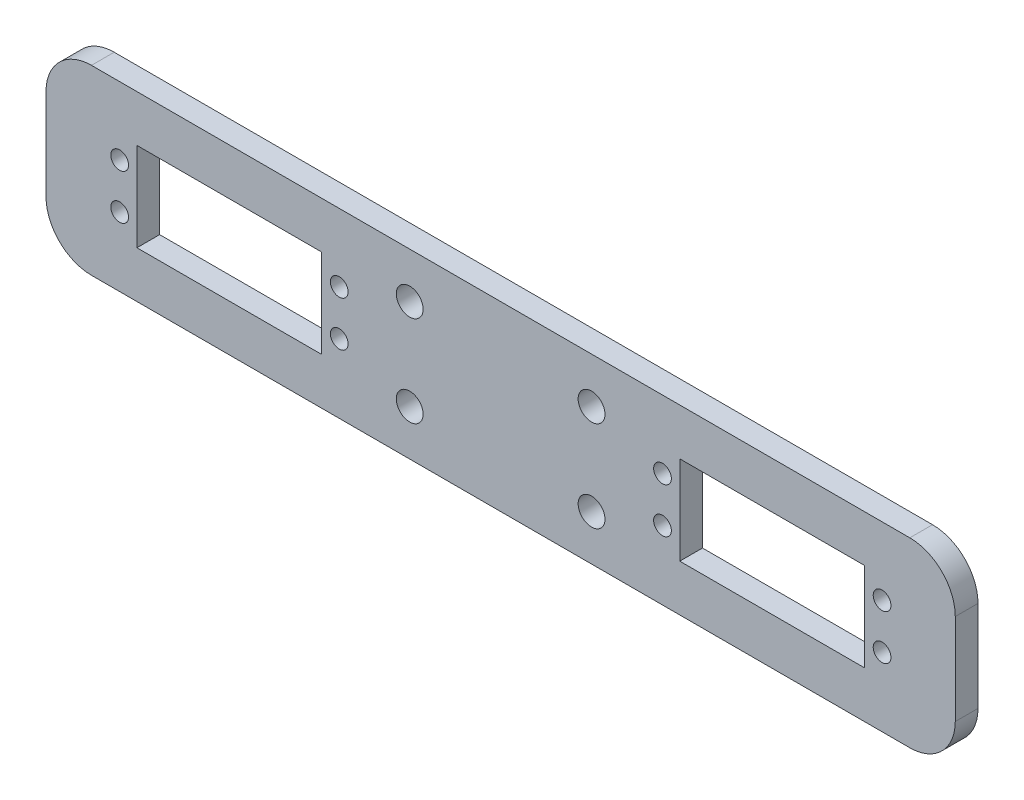
ISO-10303-21;
HEADER;
FILE_DESCRIPTION(('STEP AP214'),'2;1');
FILE_NAME('part.step','',(''),(''),'','','');
FILE_SCHEMA(('AUTOMOTIVE_DESIGN { 1 0 10303 214 1 1 1 1 }'));
ENDSEC;
DATA;
#1=APPLICATION_CONTEXT('core data for automotive mechanical design processes');
#2=APPLICATION_PROTOCOL_DEFINITION('international standard','automotive_design',2000,#1);
#3=PRODUCT_CONTEXT('',#1,'mechanical');
#4=PRODUCT('Part','Part','',(#3));
#5=PRODUCT_RELATED_PRODUCT_CATEGORY('part','',(#4));
#6=PRODUCT_DEFINITION_FORMATION('','',#4);
#7=PRODUCT_DEFINITION_CONTEXT('part definition',#1,'design');
#8=PRODUCT_DEFINITION('design','',#6,#7);
#9=PRODUCT_DEFINITION_SHAPE('','',#8);
#10=(LENGTH_UNIT() NAMED_UNIT(*) SI_UNIT(.MILLI.,.METRE.));
#11=(NAMED_UNIT(*) PLANE_ANGLE_UNIT() SI_UNIT($,.RADIAN.));
#12=(NAMED_UNIT(*) SI_UNIT($,.STERADIAN.) SOLID_ANGLE_UNIT());
#13=UNCERTAINTY_MEASURE_WITH_UNIT(LENGTH_MEASURE(1.E-05),#10,'distance_accuracy_value','');
#14=(GEOMETRIC_REPRESENTATION_CONTEXT(3) GLOBAL_UNCERTAINTY_ASSIGNED_CONTEXT((#13)) GLOBAL_UNIT_ASSIGNED_CONTEXT((#10,
#11,#12)) REPRESENTATION_CONTEXT('',''));
#15=CARTESIAN_POINT('',(0.,0.,0.));
#16=DIRECTION('',(0.,0.,1.));
#17=DIRECTION('',(1.,0.,0.));
#18=AXIS2_PLACEMENT_3D('',#15,#16,#17);
#19=CARTESIAN_POINT('',(74.9999999999999,15.,2.5));
#20=DIRECTION('',(0.,-1.,0.));
#21=DIRECTION('',(0.,0.,-1.));
#22=AXIS2_PLACEMENT_3D('',#19,#20,#21);
#23=PLANE('',#22);
#24=DIRECTION('',(-1.,0.,0.));
#25=VECTOR('',#24,1.);
#26=CARTESIAN_POINT('',(74.9999999999999,15.,2.5));
#27=LINE('',#26,#25);
#28=CARTESIAN_POINT('',(64.9999999999999,15.,2.5));
#29=VERTEX_POINT('',#28);
#30=CARTESIAN_POINT('',(-115.,15.,2.5));
#31=VERTEX_POINT('',#30);
#32=EDGE_CURVE('E195',#29,#31,#27,.T.);
#33=ORIENTED_EDGE('',*,*,#32,.F.);
#34=DIRECTION('',(0.,0.,-1.));
#35=VECTOR('',#34,1.);
#36=CARTESIAN_POINT('',(64.9999999999999,15.,2.5));
#37=LINE('',#36,#35);
#38=CARTESIAN_POINT('',(64.9999999999999,15.,-2.5));
#39=VERTEX_POINT('',#38);
#40=EDGE_CURVE('E251',#29,#39,#37,.T.);
#41=ORIENTED_EDGE('',*,*,#40,.T.);
#42=DIRECTION('',(-1.,0.,0.));
#43=VECTOR('',#42,1.);
#44=CARTESIAN_POINT('',(74.9999999999999,15.,-2.5));
#45=LINE('',#44,#43);
#46=CARTESIAN_POINT('',(-115.,15.,-2.5));
#47=VERTEX_POINT('',#46);
#48=EDGE_CURVE('E188',#39,#47,#45,.T.);
#49=ORIENTED_EDGE('',*,*,#48,.T.);
#50=DIRECTION('',(0.,0.,-1.));
#51=VECTOR('',#50,1.);
#52=CARTESIAN_POINT('',(-115.,15.,2.5));
#53=LINE('',#52,#51);
#54=EDGE_CURVE('E249',#47,#31,#53,.F.);
#55=ORIENTED_EDGE('',*,*,#54,.T.);
#56=EDGE_LOOP('',(#33,#41,#49,#55));
#57=FACE_BOUND('',#56,.T.);
#58=ADVANCED_FACE('F32',(#57),#23,.F.);
#59=CARTESIAN_POINT('',(-125.,-25.,2.5));
#60=DIRECTION('',(1.,0.,0.));
#61=DIRECTION('',(0.,1.,0.));
#62=AXIS2_PLACEMENT_3D('',#59,#60,#61);
#63=PLANE('',#62);
#64=DIRECTION('',(0.,-1.,0.));
#65=VECTOR('',#64,1.);
#66=CARTESIAN_POINT('',(-125.,-25.,-2.5));
#67=LINE('',#66,#65);
#68=CARTESIAN_POINT('',(-125.,4.99999999999997,-2.5));
#69=VERTEX_POINT('',#68);
#70=CARTESIAN_POINT('',(-125.,-15.,-2.5));
#71=VERTEX_POINT('',#70);
#72=EDGE_CURVE('E211',#69,#71,#67,.T.);
#73=ORIENTED_EDGE('',*,*,#72,.T.);
#74=DIRECTION('',(0.,0.,-1.));
#75=VECTOR('',#74,1.);
#76=CARTESIAN_POINT('',(-125.,-15.,2.5));
#77=LINE('',#76,#75);
#78=CARTESIAN_POINT('',(-125.,-15.,2.5));
#79=VERTEX_POINT('',#78);
#80=EDGE_CURVE('E234',#71,#79,#77,.F.);
#81=ORIENTED_EDGE('',*,*,#80,.T.);
#82=DIRECTION('',(0.,-1.,0.));
#83=VECTOR('',#82,1.);
#84=CARTESIAN_POINT('',(-125.,-25.,2.5));
#85=LINE('',#84,#83);
#86=CARTESIAN_POINT('',(-125.,4.99999999999997,2.5));
#87=VERTEX_POINT('',#86);
#88=EDGE_CURVE('E198',#87,#79,#85,.T.);
#89=ORIENTED_EDGE('',*,*,#88,.F.);
#90=DIRECTION('',(0.,0.,-1.));
#91=VECTOR('',#90,1.);
#92=CARTESIAN_POINT('',(-125.,4.99999999999997,2.5));
#93=LINE('',#92,#91);
#94=EDGE_CURVE('E231',#87,#69,#93,.T.);
#95=ORIENTED_EDGE('',*,*,#94,.T.);
#96=EDGE_LOOP('',(#73,#81,#89,#95));
#97=FACE_BOUND('',#96,.T.);
#98=ADVANCED_FACE('F361',(#97),#63,.F.);
#99=CARTESIAN_POINT('',(75.,-25.,2.5));
#100=DIRECTION('',(0.,1.,0.));
#101=DIRECTION('',(0.,0.,1.));
#102=AXIS2_PLACEMENT_3D('',#99,#100,#101);
#103=PLANE('',#102);
#104=DIRECTION('',(1.,0.,0.));
#105=VECTOR('',#104,1.);
#106=CARTESIAN_POINT('',(75.,-25.,2.5));
#107=LINE('',#106,#105);
#108=CARTESIAN_POINT('',(-115.,-25.,2.5));
#109=VERTEX_POINT('',#108);
#110=CARTESIAN_POINT('',(65.,-25.,2.5));
#111=VERTEX_POINT('',#110);
#112=EDGE_CURVE('E202',#109,#111,#107,.T.);
#113=ORIENTED_EDGE('',*,*,#112,.F.);
#114=DIRECTION('',(0.,0.,-1.));
#115=VECTOR('',#114,1.);
#116=CARTESIAN_POINT('',(-115.,-25.,2.5));
#117=LINE('',#116,#115);
#118=CARTESIAN_POINT('',(-115.,-25.,-2.5));
#119=VERTEX_POINT('',#118);
#120=EDGE_CURVE('E220',#109,#119,#117,.T.);
#121=ORIENTED_EDGE('',*,*,#120,.T.);
#122=DIRECTION('',(1.,0.,0.));
#123=VECTOR('',#122,1.);
#124=CARTESIAN_POINT('',(75.,-25.,-2.5));
#125=LINE('',#124,#123);
#126=CARTESIAN_POINT('',(65.,-25.,-2.5));
#127=VERTEX_POINT('',#126);
#128=EDGE_CURVE('E214',#119,#127,#125,.T.);
#129=ORIENTED_EDGE('',*,*,#128,.T.);
#130=DIRECTION('',(0.,0.,-1.));
#131=VECTOR('',#130,1.);
#132=CARTESIAN_POINT('',(65.,-25.,2.5));
#133=LINE('',#132,#131);
#134=EDGE_CURVE('E208',#127,#111,#133,.F.);
#135=ORIENTED_EDGE('',*,*,#134,.T.);
#136=EDGE_LOOP('',(#113,#121,#129,#135));
#137=FACE_BOUND('',#136,.T.);
#138=ADVANCED_FACE('F354',(#137),#103,.F.);
#139=CARTESIAN_POINT('',(75.,-25.,2.5));
#140=DIRECTION('',(-1.,0.,0.));
#141=DIRECTION('',(0.,-1.,0.));
#142=AXIS2_PLACEMENT_3D('',#139,#140,#141);
#143=PLANE('',#142);
#144=DIRECTION('',(0.,1.,0.));
#145=VECTOR('',#144,1.);
#146=CARTESIAN_POINT('',(75.,-25.,2.5));
#147=LINE('',#146,#145);
#148=CARTESIAN_POINT('',(75.,-15.,2.5));
#149=VERTEX_POINT('',#148);
#150=CARTESIAN_POINT('',(74.9999999999999,5.,2.5));
#151=VERTEX_POINT('',#150);
#152=EDGE_CURVE('E205',#149,#151,#147,.T.);
#153=ORIENTED_EDGE('',*,*,#152,.F.);
#154=DIRECTION('',(0.,0.,-1.));
#155=VECTOR('',#154,1.);
#156=CARTESIAN_POINT('',(75.,-15.,2.5));
#157=LINE('',#156,#155);
#158=CARTESIAN_POINT('',(75.,-15.,-2.5));
#159=VERTEX_POINT('',#158);
#160=EDGE_CURVE('E246',#149,#159,#157,.T.);
#161=ORIENTED_EDGE('',*,*,#160,.T.);
#162=DIRECTION('',(0.,1.,0.));
#163=VECTOR('',#162,1.);
#164=CARTESIAN_POINT('',(75.,-25.,-2.5));
#165=LINE('',#164,#163);
#166=CARTESIAN_POINT('',(74.9999999999999,5.,-2.5));
#167=VERTEX_POINT('',#166);
#168=EDGE_CURVE('E199',#159,#167,#165,.T.);
#169=ORIENTED_EDGE('',*,*,#168,.T.);
#170=DIRECTION('',(0.,0.,-1.));
#171=VECTOR('',#170,1.);
#172=CARTESIAN_POINT('',(74.9999999999999,5.,2.5));
#173=LINE('',#172,#171);
#174=EDGE_CURVE('E244',#167,#151,#173,.F.);
#175=ORIENTED_EDGE('',*,*,#174,.T.);
#176=EDGE_LOOP('',(#153,#161,#169,#175));
#177=FACE_BOUND('',#176,.T.);
#178=ADVANCED_FACE('F344',(#177),#143,.F.);
#179=CARTESIAN_POINT('',(-125.,15.,2.5));
#180=DIRECTION('',(0.,0.,-1.));
#181=DIRECTION('',(-1.,0.,0.));
#182=AXIS2_PLACEMENT_3D('',#179,#180,#181);
#183=PLANE('',#182);
#184=CARTESIAN_POINT('',(-5.00000000000005,5.00000000000001,2.5));
#185=DIRECTION('',(0.,0.,1.));
#186=DIRECTION('',(-1.,0.,0.));
#187=AXIS2_PLACEMENT_3D('',#184,#185,#186);
#188=CIRCLE('',#187,2.95);
#189=CARTESIAN_POINT('',(-7.95000000000005,5.00000000000001,2.5));
#190=VERTEX_POINT('',#189);
#191=EDGE_CURVE('E318',#190,#190,#188,.T.);
#192=ORIENTED_EDGE('',*,*,#191,.F.);
#193=EDGE_LOOP('',(#192));
#194=FACE_BOUND('',#193,.T.);
#195=CARTESIAN_POINT('',(-5.00000000000005,-15.,2.5));
#196=DIRECTION('',(0.,0.,1.));
#197=DIRECTION('',(1.,0.,0.));
#198=AXIS2_PLACEMENT_3D('',#195,#196,#197);
#199=CIRCLE('',#198,2.95);
#200=CARTESIAN_POINT('',(-2.05000000000005,-15.,2.5));
#201=VERTEX_POINT('',#200);
#202=EDGE_CURVE('E308',#201,#201,#199,.T.);
#203=ORIENTED_EDGE('',*,*,#202,.F.);
#204=EDGE_LOOP('',(#203));
#205=FACE_BOUND('',#204,.T.);
#206=CARTESIAN_POINT('',(-45.,-15.,2.5));
#207=DIRECTION('',(0.,0.,1.));
#208=DIRECTION('',(-1.,0.,0.));
#209=AXIS2_PLACEMENT_3D('',#206,#207,#208);
#210=CIRCLE('',#209,2.95);
#211=CARTESIAN_POINT('',(-47.95,-15.,2.5));
#212=VERTEX_POINT('',#211);
#213=EDGE_CURVE('E305',#212,#212,#210,.T.);
#214=ORIENTED_EDGE('',*,*,#213,.F.);
#215=EDGE_LOOP('',(#214));
#216=FACE_BOUND('',#215,.T.);
#217=CARTESIAN_POINT('',(-45.,5.00000000000001,2.5));
#218=DIRECTION('',(0.,0.,1.));
#219=DIRECTION('',(1.,0.,0.));
#220=AXIS2_PLACEMENT_3D('',#217,#218,#219);
#221=CIRCLE('',#220,2.95);
#222=CARTESIAN_POINT('',(-42.05,5.00000000000001,2.5));
#223=VERTEX_POINT('',#222);
#224=EDGE_CURVE('E302',#223,#223,#221,.T.);
#225=ORIENTED_EDGE('',*,*,#224,.F.);
#226=EDGE_LOOP('',(#225));
#227=FACE_BOUND('',#226,.T.);
#228=CARTESIAN_POINT('',(-60.5,-9.84999999999999,2.5));
#229=DIRECTION('',(0.,0.,1.));
#230=DIRECTION('',(1.,0.,0.));
#231=AXIS2_PLACEMENT_3D('',#228,#229,#230);
#232=CIRCLE('',#231,1.95);
#233=CARTESIAN_POINT('',(-58.55,-9.84999999999999,2.5));
#234=VERTEX_POINT('',#233);
#235=EDGE_CURVE('E298',#234,#234,#232,.T.);
#236=ORIENTED_EDGE('',*,*,#235,.F.);
#237=EDGE_LOOP('',(#236));
#238=FACE_BOUND('',#237,.T.);
#239=CARTESIAN_POINT('',(-60.5,0.0500000000000092,2.5));
#240=DIRECTION('',(0.,0.,1.));
#241=DIRECTION('',(1.,0.,0.));
#242=AXIS2_PLACEMENT_3D('',#239,#240,#241);
#243=CIRCLE('',#242,1.95);
#244=CARTESIAN_POINT('',(-58.55,0.0500000000000092,2.5));
#245=VERTEX_POINT('',#244);
#246=EDGE_CURVE('E294',#245,#245,#243,.T.);
#247=ORIENTED_EDGE('',*,*,#246,.F.);
#248=EDGE_LOOP('',(#247));
#249=FACE_BOUND('',#248,.T.);
#250=CARTESIAN_POINT('',(-108.8,0.0500000000000006,2.5));
#251=DIRECTION('',(0.,0.,1.));
#252=DIRECTION('',(1.,0.,0.));
#253=AXIS2_PLACEMENT_3D('',#250,#251,#252);
#254=CIRCLE('',#253,1.95);
#255=CARTESIAN_POINT('',(-106.85,0.0500000000000006,2.5));
#256=VERTEX_POINT('',#255);
#257=EDGE_CURVE('E290',#256,#256,#254,.T.);
#258=ORIENTED_EDGE('',*,*,#257,.F.);
#259=EDGE_LOOP('',(#258));
#260=FACE_BOUND('',#259,.T.);
#261=CARTESIAN_POINT('',(-108.8,-9.85,2.5));
#262=DIRECTION('',(0.,0.,1.));
#263=DIRECTION('',(1.,0.,0.));
#264=AXIS2_PLACEMENT_3D('',#261,#262,#263);
#265=CIRCLE('',#264,1.95);
#266=CARTESIAN_POINT('',(-106.85,-9.85,2.5));
#267=VERTEX_POINT('',#266);
#268=EDGE_CURVE('E286',#267,#267,#265,.T.);
#269=ORIENTED_EDGE('',*,*,#268,.F.);
#270=EDGE_LOOP('',(#269));
#271=FACE_BOUND('',#270,.T.);
#272=CARTESIAN_POINT('',(10.6,-9.85,2.5));
#273=DIRECTION('',(0.,0.,1.));
#274=DIRECTION('',(1.,0.,0.));
#275=AXIS2_PLACEMENT_3D('',#272,#273,#274);
#276=CIRCLE('',#275,1.95);
#277=CARTESIAN_POINT('',(12.55,-9.85,2.5));
#278=VERTEX_POINT('',#277);
#279=EDGE_CURVE('E282',#278,#278,#276,.T.);
#280=ORIENTED_EDGE('',*,*,#279,.F.);
#281=EDGE_LOOP('',(#280));
#282=FACE_BOUND('',#281,.T.);
#283=CARTESIAN_POINT('',(10.6,0.0500000000000014,2.5));
#284=DIRECTION('',(0.,0.,1.));
#285=DIRECTION('',(1.,0.,0.));
#286=AXIS2_PLACEMENT_3D('',#283,#284,#285);
#287=CIRCLE('',#286,1.95);
#288=CARTESIAN_POINT('',(12.55,0.0500000000000014,2.5));
#289=VERTEX_POINT('',#288);
#290=EDGE_CURVE('E278',#289,#289,#287,.T.);
#291=ORIENTED_EDGE('',*,*,#290,.F.);
#292=EDGE_LOOP('',(#291));
#293=FACE_BOUND('',#292,.T.);
#294=CARTESIAN_POINT('',(58.9,0.0500000000000101,2.5));
#295=DIRECTION('',(0.,0.,1.));
#296=DIRECTION('',(1.,0.,0.));
#297=AXIS2_PLACEMENT_3D('',#294,#295,#296);
#298=CIRCLE('',#297,1.95);
#299=CARTESIAN_POINT('',(60.85,0.0500000000000101,2.5));
#300=VERTEX_POINT('',#299);
#301=EDGE_CURVE('E274',#300,#300,#298,.T.);
#302=ORIENTED_EDGE('',*,*,#301,.F.);
#303=EDGE_LOOP('',(#302));
#304=FACE_BOUND('',#303,.T.);
#305=CARTESIAN_POINT('',(58.9,-9.84999999999999,2.5));
#306=DIRECTION('',(0.,0.,1.));
#307=DIRECTION('',(1.,0.,0.));
#308=AXIS2_PLACEMENT_3D('',#305,#306,#307);
#309=CIRCLE('',#308,1.95);
#310=CARTESIAN_POINT('',(60.85,-9.84999999999999,2.5));
#311=VERTEX_POINT('',#310);
#312=EDGE_CURVE('E270',#311,#311,#309,.T.);
#313=ORIENTED_EDGE('',*,*,#312,.F.);
#314=EDGE_LOOP('',(#313));
#315=FACE_BOUND('',#314,.T.);
#316=DIRECTION('',(-1.,0.,0.));
#317=VECTOR('',#316,1.);
#318=CARTESIAN_POINT('',(55.,4.74999999999999,2.5));
#319=LINE('',#318,#317);
#320=CARTESIAN_POINT('',(55.,4.74999999999999,2.5));
#321=VERTEX_POINT('',#320);
#322=CARTESIAN_POINT('',(14.4,4.74999999999999,2.5));
#323=VERTEX_POINT('',#322);
#324=EDGE_CURVE('E158',#321,#323,#319,.T.);
#325=ORIENTED_EDGE('',*,*,#324,.F.);
#326=DIRECTION('',(0.,1.,0.));
#327=VECTOR('',#326,1.);
#328=CARTESIAN_POINT('',(55.,-14.75,2.5));
#329=LINE('',#328,#327);
#330=CARTESIAN_POINT('',(55.,-14.75,2.5));
#331=VERTEX_POINT('',#330);
#332=EDGE_CURVE('E49',#331,#321,#329,.T.);
#333=ORIENTED_EDGE('',*,*,#332,.F.);
#334=DIRECTION('',(1.,0.,0.));
#335=VECTOR('',#334,1.);
#336=CARTESIAN_POINT('',(55.,-14.75,2.5));
#337=LINE('',#336,#335);
#338=CARTESIAN_POINT('',(14.4,-14.75,2.5));
#339=VERTEX_POINT('',#338);
#340=EDGE_CURVE('E165',#339,#331,#337,.T.);
#341=ORIENTED_EDGE('',*,*,#340,.F.);
#342=DIRECTION('',(0.,-1.,0.));
#343=VECTOR('',#342,1.);
#344=CARTESIAN_POINT('',(14.4,4.74999999999999,2.5));
#345=LINE('',#344,#343);
#346=EDGE_CURVE('E149',#323,#339,#345,.T.);
#347=ORIENTED_EDGE('',*,*,#346,.F.);
#348=EDGE_LOOP('',(#325,#333,#341,#347));
#349=FACE_BOUND('',#348,.T.);
#350=DIRECTION('',(0.,1.,0.));
#351=VECTOR('',#350,1.);
#352=CARTESIAN_POINT('',(-64.4,4.74999999999999,2.5));
#353=LINE('',#352,#351);
#354=CARTESIAN_POINT('',(-64.4,-14.75,2.5));
#355=VERTEX_POINT('',#354);
#356=CARTESIAN_POINT('',(-64.4,4.74999999999999,2.5));
#357=VERTEX_POINT('',#356);
#358=EDGE_CURVE('E176',#355,#357,#353,.T.);
#359=ORIENTED_EDGE('',*,*,#358,.F.);
#360=DIRECTION('',(1.,0.,0.));
#361=VECTOR('',#360,1.);
#362=CARTESIAN_POINT('',(-105.,-14.75,2.5));
#363=LINE('',#362,#361);
#364=CARTESIAN_POINT('',(-105.,-14.75,2.5));
#365=VERTEX_POINT('',#364);
#366=EDGE_CURVE('E172',#365,#355,#363,.T.);
#367=ORIENTED_EDGE('',*,*,#366,.F.);
#368=DIRECTION('',(0.,-1.,0.));
#369=VECTOR('',#368,1.);
#370=CARTESIAN_POINT('',(-105.,-14.75,2.5));
#371=LINE('',#370,#369);
#372=CARTESIAN_POINT('',(-105.,4.74999999999999,2.5));
#373=VERTEX_POINT('',#372);
#374=EDGE_CURVE('E182',#373,#365,#371,.T.);
#375=ORIENTED_EDGE('',*,*,#374,.F.);
#376=DIRECTION('',(-1.,0.,0.));
#377=VECTOR('',#376,1.);
#378=CARTESIAN_POINT('',(-105.,4.74999999999999,2.5));
#379=LINE('',#378,#377);
#380=EDGE_CURVE('E179',#357,#373,#379,.T.);
#381=ORIENTED_EDGE('',*,*,#380,.F.);
#382=EDGE_LOOP('',(#359,#367,#375,#381));
#383=FACE_BOUND('',#382,.T.);
#384=ORIENTED_EDGE('',*,*,#88,.T.);
#385=CARTESIAN_POINT('',(-115.,-15.,2.5));
#386=DIRECTION('',(0.,0.,-1.));
#387=DIRECTION('',(-1.,0.,0.));
#388=AXIS2_PLACEMENT_3D('',#385,#386,#387);
#389=CIRCLE('',#388,10.);
#390=EDGE_CURVE('E242',#79,#109,#389,.F.);
#391=ORIENTED_EDGE('',*,*,#390,.T.);
#392=ORIENTED_EDGE('',*,*,#112,.T.);
#393=CARTESIAN_POINT('',(65.,-15.,2.5));
#394=DIRECTION('',(0.,0.,-1.));
#395=DIRECTION('',(-1.,0.,0.));
#396=AXIS2_PLACEMENT_3D('',#393,#394,#395);
#397=CIRCLE('',#396,10.);
#398=EDGE_CURVE('E240',#111,#149,#397,.F.);
#399=ORIENTED_EDGE('',*,*,#398,.T.);
#400=ORIENTED_EDGE('',*,*,#152,.T.);
#401=CARTESIAN_POINT('',(64.9999999999999,5.,2.5));
#402=DIRECTION('',(0.,0.,-1.));
#403=DIRECTION('',(-1.,0.,0.));
#404=AXIS2_PLACEMENT_3D('',#401,#402,#403);
#405=CIRCLE('',#404,10.);
#406=EDGE_CURVE('E238',#151,#29,#405,.F.);
#407=ORIENTED_EDGE('',*,*,#406,.T.);
#408=ORIENTED_EDGE('',*,*,#32,.T.);
#409=CARTESIAN_POINT('',(-115.,5.,2.5));
#410=DIRECTION('',(0.,0.,-1.));
#411=DIRECTION('',(-1.,0.,0.));
#412=AXIS2_PLACEMENT_3D('',#409,#410,#411);
#413=CIRCLE('',#412,10.);
#414=EDGE_CURVE('E236',#31,#87,#413,.F.);
#415=ORIENTED_EDGE('',*,*,#414,.T.);
#416=EDGE_LOOP('',(#384,#391,#392,#399,#400,#407,#408,#415));
#417=FACE_BOUND('',#416,.T.);
#418=ADVANCED_FACE('F162',(#194,#205,#216,#227,#238,#249,#260,#271,#282,#293,#304,#315,#349,
#383,#417),#183,.F.);
#419=CARTESIAN_POINT('',(-125.,15.,-2.5));
#420=DIRECTION('',(0.,0.,-1.));
#421=DIRECTION('',(-1.,0.,0.));
#422=AXIS2_PLACEMENT_3D('',#419,#420,#421);
#423=PLANE('',#422);
#424=CARTESIAN_POINT('',(-5.00000000000005,5.00000000000001,-2.5));
#425=DIRECTION('',(0.,0.,-1.));
#426=DIRECTION('',(-1.,0.,0.));
#427=AXIS2_PLACEMENT_3D('',#424,#425,#426);
#428=CIRCLE('',#427,2.95);
#429=CARTESIAN_POINT('',(-7.95000000000005,5.00000000000001,-2.5));
#430=VERTEX_POINT('',#429);
#431=EDGE_CURVE('E36',#430,#430,#428,.T.);
#432=ORIENTED_EDGE('',*,*,#431,.F.);
#433=EDGE_LOOP('',(#432));
#434=FACE_BOUND('',#433,.T.);
#435=CARTESIAN_POINT('',(-5.00000000000005,-15.,-2.5));
#436=DIRECTION('',(0.,0.,-1.));
#437=DIRECTION('',(-1.,0.,0.));
#438=AXIS2_PLACEMENT_3D('',#435,#436,#437);
#439=CIRCLE('',#438,2.95);
#440=CARTESIAN_POINT('',(-7.95000000000006,-15.,-2.5));
#441=VERTEX_POINT('',#440);
#442=EDGE_CURVE('E306',#441,#441,#439,.T.);
#443=ORIENTED_EDGE('',*,*,#442,.F.);
#444=EDGE_LOOP('',(#443));
#445=FACE_BOUND('',#444,.T.);
#446=CARTESIAN_POINT('',(-45.,-15.,-2.5));
#447=DIRECTION('',(0.,0.,-1.));
#448=DIRECTION('',(-1.,0.,0.));
#449=AXIS2_PLACEMENT_3D('',#446,#447,#448);
#450=CIRCLE('',#449,2.95);
#451=CARTESIAN_POINT('',(-47.95,-15.,-2.5));
#452=VERTEX_POINT('',#451);
#453=EDGE_CURVE('E303',#452,#452,#450,.T.);
#454=ORIENTED_EDGE('',*,*,#453,.F.);
#455=EDGE_LOOP('',(#454));
#456=FACE_BOUND('',#455,.T.);
#457=CARTESIAN_POINT('',(-45.,5.00000000000001,-2.5));
#458=DIRECTION('',(0.,0.,-1.));
#459=DIRECTION('',(-1.,0.,0.));
#460=AXIS2_PLACEMENT_3D('',#457,#458,#459);
#461=CIRCLE('',#460,2.95);
#462=CARTESIAN_POINT('',(-47.95,5.00000000000001,-2.5));
#463=VERTEX_POINT('',#462);
#464=EDGE_CURVE('E299',#463,#463,#461,.T.);
#465=ORIENTED_EDGE('',*,*,#464,.F.);
#466=EDGE_LOOP('',(#465));
#467=FACE_BOUND('',#466,.T.);
#468=CARTESIAN_POINT('',(-60.5,-9.84999999999999,-2.5));
#469=DIRECTION('',(0.,0.,-1.));
#470=DIRECTION('',(-1.,0.,0.));
#471=AXIS2_PLACEMENT_3D('',#468,#469,#470);
#472=CIRCLE('',#471,1.95);
#473=CARTESIAN_POINT('',(-62.45,-9.84999999999999,-2.5));
#474=VERTEX_POINT('',#473);
#475=EDGE_CURVE('E295',#474,#474,#472,.T.);
#476=ORIENTED_EDGE('',*,*,#475,.F.);
#477=EDGE_LOOP('',(#476));
#478=FACE_BOUND('',#477,.T.);
#479=CARTESIAN_POINT('',(-60.5,0.0500000000000092,-2.5));
#480=DIRECTION('',(0.,0.,-1.));
#481=DIRECTION('',(-1.,0.,0.));
#482=AXIS2_PLACEMENT_3D('',#479,#480,#481);
#483=CIRCLE('',#482,1.95);
#484=CARTESIAN_POINT('',(-62.45,0.0500000000000092,-2.5));
#485=VERTEX_POINT('',#484);
#486=EDGE_CURVE('E291',#485,#485,#483,.T.);
#487=ORIENTED_EDGE('',*,*,#486,.F.);
#488=EDGE_LOOP('',(#487));
#489=FACE_BOUND('',#488,.T.);
#490=CARTESIAN_POINT('',(-108.8,0.0500000000000006,-2.5));
#491=DIRECTION('',(0.,0.,-1.));
#492=DIRECTION('',(-1.,0.,0.));
#493=AXIS2_PLACEMENT_3D('',#490,#491,#492);
#494=CIRCLE('',#493,1.95);
#495=CARTESIAN_POINT('',(-110.75,0.0500000000000006,-2.5));
#496=VERTEX_POINT('',#495);
#497=EDGE_CURVE('E287',#496,#496,#494,.T.);
#498=ORIENTED_EDGE('',*,*,#497,.F.);
#499=EDGE_LOOP('',(#498));
#500=FACE_BOUND('',#499,.T.);
#501=CARTESIAN_POINT('',(-108.8,-9.85,-2.5));
#502=DIRECTION('',(0.,0.,-1.));
#503=DIRECTION('',(-1.,0.,0.));
#504=AXIS2_PLACEMENT_3D('',#501,#502,#503);
#505=CIRCLE('',#504,1.95);
#506=CARTESIAN_POINT('',(-110.75,-9.85,-2.5));
#507=VERTEX_POINT('',#506);
#508=EDGE_CURVE('E283',#507,#507,#505,.T.);
#509=ORIENTED_EDGE('',*,*,#508,.F.);
#510=EDGE_LOOP('',(#509));
#511=FACE_BOUND('',#510,.T.);
#512=CARTESIAN_POINT('',(10.6,-9.85,-2.5));
#513=DIRECTION('',(0.,0.,-1.));
#514=DIRECTION('',(-1.,0.,0.));
#515=AXIS2_PLACEMENT_3D('',#512,#513,#514);
#516=CIRCLE('',#515,1.95);
#517=CARTESIAN_POINT('',(8.64999999999996,-9.85,-2.5));
#518=VERTEX_POINT('',#517);
#519=EDGE_CURVE('E279',#518,#518,#516,.T.);
#520=ORIENTED_EDGE('',*,*,#519,.F.);
#521=EDGE_LOOP('',(#520));
#522=FACE_BOUND('',#521,.T.);
#523=CARTESIAN_POINT('',(10.6,0.0500000000000014,-2.5));
#524=DIRECTION('',(0.,0.,-1.));
#525=DIRECTION('',(-1.,0.,0.));
#526=AXIS2_PLACEMENT_3D('',#523,#524,#525);
#527=CIRCLE('',#526,1.95);
#528=CARTESIAN_POINT('',(8.64999999999996,0.0500000000000014,-2.5));
#529=VERTEX_POINT('',#528);
#530=EDGE_CURVE('E275',#529,#529,#527,.T.);
#531=ORIENTED_EDGE('',*,*,#530,.F.);
#532=EDGE_LOOP('',(#531));
#533=FACE_BOUND('',#532,.T.);
#534=CARTESIAN_POINT('',(58.9,0.0500000000000101,-2.5));
#535=DIRECTION('',(0.,0.,-1.));
#536=DIRECTION('',(-1.,0.,0.));
#537=AXIS2_PLACEMENT_3D('',#534,#535,#536);
#538=CIRCLE('',#537,1.95);
#539=CARTESIAN_POINT('',(56.95,0.0500000000000101,-2.5));
#540=VERTEX_POINT('',#539);
#541=EDGE_CURVE('E271',#540,#540,#538,.T.);
#542=ORIENTED_EDGE('',*,*,#541,.F.);
#543=EDGE_LOOP('',(#542));
#544=FACE_BOUND('',#543,.T.);
#545=CARTESIAN_POINT('',(58.9,-9.84999999999999,-2.5));
#546=DIRECTION('',(0.,0.,-1.));
#547=DIRECTION('',(-1.,0.,0.));
#548=AXIS2_PLACEMENT_3D('',#545,#546,#547);
#549=CIRCLE('',#548,1.95);
#550=CARTESIAN_POINT('',(56.95,-9.84999999999999,-2.5));
#551=VERTEX_POINT('',#550);
#552=EDGE_CURVE('E267',#551,#551,#549,.T.);
#553=ORIENTED_EDGE('',*,*,#552,.F.);
#554=EDGE_LOOP('',(#553));
#555=FACE_BOUND('',#554,.T.);
#556=DIRECTION('',(0.,-1.,0.));
#557=VECTOR('',#556,1.);
#558=CARTESIAN_POINT('',(55.,15.,-2.5));
#559=LINE('',#558,#557);
#560=CARTESIAN_POINT('',(55.,4.74999999999999,-2.5));
#561=VERTEX_POINT('',#560);
#562=CARTESIAN_POINT('',(55.,-14.75,-2.5));
#563=VERTEX_POINT('',#562);
#564=EDGE_CURVE('E11',#561,#563,#559,.T.);
#565=ORIENTED_EDGE('',*,*,#564,.F.);
#566=DIRECTION('',(1.,0.,0.));
#567=VECTOR('',#566,1.);
#568=CARTESIAN_POINT('',(-125.,4.74999999999999,-2.5));
#569=LINE('',#568,#567);
#570=CARTESIAN_POINT('',(14.4,4.74999999999999,-2.5));
#571=VERTEX_POINT('',#570);
#572=EDGE_CURVE('E263',#571,#561,#569,.T.);
#573=ORIENTED_EDGE('',*,*,#572,.F.);
#574=DIRECTION('',(0.,1.,0.));
#575=VECTOR('',#574,1.);
#576=CARTESIAN_POINT('',(14.4,15.,-2.5));
#577=LINE('',#576,#575);
#578=CARTESIAN_POINT('',(14.4,-14.75,-2.5));
#579=VERTEX_POINT('',#578);
#580=EDGE_CURVE('E152',#579,#571,#577,.T.);
#581=ORIENTED_EDGE('',*,*,#580,.F.);
#582=DIRECTION('',(-1.,0.,0.));
#583=VECTOR('',#582,1.);
#584=CARTESIAN_POINT('',(-125.,-14.75,-2.5));
#585=LINE('',#584,#583);
#586=EDGE_CURVE('E41',#563,#579,#585,.T.);
#587=ORIENTED_EDGE('',*,*,#586,.F.);
#588=EDGE_LOOP('',(#565,#573,#581,#587));
#589=FACE_BOUND('',#588,.T.);
#590=DIRECTION('',(-1.,0.,0.));
#591=VECTOR('',#590,1.);
#592=CARTESIAN_POINT('',(-125.,-14.75,-2.5));
#593=LINE('',#592,#591);
#594=CARTESIAN_POINT('',(-64.4,-14.75,-2.5));
#595=VERTEX_POINT('',#594);
#596=CARTESIAN_POINT('',(-105.,-14.75,-2.5));
#597=VERTEX_POINT('',#596);
#598=EDGE_CURVE('E261',#595,#597,#593,.T.);
#599=ORIENTED_EDGE('',*,*,#598,.F.);
#600=DIRECTION('',(0.,-1.,0.));
#601=VECTOR('',#600,1.);
#602=CARTESIAN_POINT('',(-64.4,15.,-2.5));
#603=LINE('',#602,#601);
#604=CARTESIAN_POINT('',(-64.4,4.74999999999999,-2.5));
#605=VERTEX_POINT('',#604);
#606=EDGE_CURVE('E254',#605,#595,#603,.T.);
#607=ORIENTED_EDGE('',*,*,#606,.F.);
#608=DIRECTION('',(1.,0.,0.));
#609=VECTOR('',#608,1.);
#610=CARTESIAN_POINT('',(-125.,4.74999999999999,-2.5));
#611=LINE('',#610,#609);
#612=CARTESIAN_POINT('',(-105.,4.74999999999999,-2.5));
#613=VERTEX_POINT('',#612);
#614=EDGE_CURVE('E256',#613,#605,#611,.T.);
#615=ORIENTED_EDGE('',*,*,#614,.F.);
#616=DIRECTION('',(0.,1.,0.));
#617=VECTOR('',#616,1.);
#618=CARTESIAN_POINT('',(-105.,15.,-2.5));
#619=LINE('',#618,#617);
#620=EDGE_CURVE('E259',#597,#613,#619,.T.);
#621=ORIENTED_EDGE('',*,*,#620,.F.);
#622=EDGE_LOOP('',(#599,#607,#615,#621));
#623=FACE_BOUND('',#622,.T.);
#624=ORIENTED_EDGE('',*,*,#128,.F.);
#625=CARTESIAN_POINT('',(-115.,-15.,-2.5));
#626=DIRECTION('',(0.,0.,-1.));
#627=DIRECTION('',(-1.,0.,0.));
#628=AXIS2_PLACEMENT_3D('',#625,#626,#627);
#629=CIRCLE('',#628,10.);
#630=EDGE_CURVE('E229',#119,#71,#629,.T.);
#631=ORIENTED_EDGE('',*,*,#630,.T.);
#632=ORIENTED_EDGE('',*,*,#72,.F.);
#633=CARTESIAN_POINT('',(-115.,5.,-2.5));
#634=DIRECTION('',(0.,0.,-1.));
#635=DIRECTION('',(-1.,0.,0.));
#636=AXIS2_PLACEMENT_3D('',#633,#634,#635);
#637=CIRCLE('',#636,10.);
#638=EDGE_CURVE('E223',#69,#47,#637,.T.);
#639=ORIENTED_EDGE('',*,*,#638,.T.);
#640=ORIENTED_EDGE('',*,*,#48,.F.);
#641=CARTESIAN_POINT('',(64.9999999999999,5.,-2.5));
#642=DIRECTION('',(0.,0.,-1.));
#643=DIRECTION('',(-1.,0.,0.));
#644=AXIS2_PLACEMENT_3D('',#641,#642,#643);
#645=CIRCLE('',#644,10.);
#646=EDGE_CURVE('E225',#39,#167,#645,.T.);
#647=ORIENTED_EDGE('',*,*,#646,.T.);
#648=ORIENTED_EDGE('',*,*,#168,.F.);
#649=CARTESIAN_POINT('',(65.,-15.,-2.5));
#650=DIRECTION('',(0.,0.,-1.));
#651=DIRECTION('',(-1.,0.,0.));
#652=AXIS2_PLACEMENT_3D('',#649,#650,#651);
#653=CIRCLE('',#652,10.);
#654=EDGE_CURVE('E227',#159,#127,#653,.T.);
#655=ORIENTED_EDGE('',*,*,#654,.T.);
#656=EDGE_LOOP('',(#624,#631,#632,#639,#640,#647,#648,#655));
#657=FACE_BOUND('',#656,.T.);
#658=ADVANCED_FACE('F343',(#434,#445,#456,#467,#478,#489,#500,#511,#522,#533,#544,#555,#589,
#623,#657),#423,.T.);
#659=CARTESIAN_POINT('',(-115.,-15.,2.5));
#660=DIRECTION('',(0.,0.,-1.));
#661=DIRECTION('',(-1.,0.,0.));
#662=AXIS2_PLACEMENT_3D('',#659,#660,#661);
#663=CYLINDRICAL_SURFACE('',#662,10.);
#664=ORIENTED_EDGE('',*,*,#390,.F.);
#665=ORIENTED_EDGE('',*,*,#80,.F.);
#666=ORIENTED_EDGE('',*,*,#630,.F.);
#667=ORIENTED_EDGE('',*,*,#120,.F.);
#668=EDGE_LOOP('',(#664,#665,#666,#667));
#669=FACE_BOUND('',#668,.T.);
#670=ADVANCED_FACE('F351',(#669),#663,.T.);
#671=CARTESIAN_POINT('',(65.,-15.,2.5));
#672=DIRECTION('',(0.,0.,-1.));
#673=DIRECTION('',(-1.,0.,0.));
#674=AXIS2_PLACEMENT_3D('',#671,#672,#673);
#675=CYLINDRICAL_SURFACE('',#674,10.);
#676=ORIENTED_EDGE('',*,*,#398,.F.);
#677=ORIENTED_EDGE('',*,*,#134,.F.);
#678=ORIENTED_EDGE('',*,*,#654,.F.);
#679=ORIENTED_EDGE('',*,*,#160,.F.);
#680=EDGE_LOOP('',(#676,#677,#678,#679));
#681=FACE_BOUND('',#680,.T.);
#682=ADVANCED_FACE('F374',(#681),#675,.T.);
#683=CARTESIAN_POINT('',(64.9999999999999,5.,2.5));
#684=DIRECTION('',(0.,0.,-1.));
#685=DIRECTION('',(-1.,0.,0.));
#686=AXIS2_PLACEMENT_3D('',#683,#684,#685);
#687=CYLINDRICAL_SURFACE('',#686,10.);
#688=ORIENTED_EDGE('',*,*,#406,.F.);
#689=ORIENTED_EDGE('',*,*,#174,.F.);
#690=ORIENTED_EDGE('',*,*,#646,.F.);
#691=ORIENTED_EDGE('',*,*,#40,.F.);
#692=EDGE_LOOP('',(#688,#689,#690,#691));
#693=FACE_BOUND('',#692,.T.);
#694=ADVANCED_FACE('F377',(#693),#687,.T.);
#695=CARTESIAN_POINT('',(-115.,5.,2.5));
#696=DIRECTION('',(0.,0.,-1.));
#697=DIRECTION('',(-1.,0.,0.));
#698=AXIS2_PLACEMENT_3D('',#695,#696,#697);
#699=CYLINDRICAL_SURFACE('',#698,10.);
#700=ORIENTED_EDGE('',*,*,#414,.F.);
#701=ORIENTED_EDGE('',*,*,#54,.F.);
#702=ORIENTED_EDGE('',*,*,#638,.F.);
#703=ORIENTED_EDGE('',*,*,#94,.F.);
#704=EDGE_LOOP('',(#700,#701,#702,#703));
#705=FACE_BOUND('',#704,.T.);
#706=ADVANCED_FACE('F34',(#705),#699,.T.);
#707=CARTESIAN_POINT('',(-105.,-14.75,-7.5));
#708=DIRECTION('',(0.,-1.,0.));
#709=DIRECTION('',(0.,0.,-1.));
#710=AXIS2_PLACEMENT_3D('',#707,#708,#709);
#711=PLANE('',#710);
#712=ORIENTED_EDGE('',*,*,#598,.T.);
#713=DIRECTION('',(0.,0.,1.));
#714=VECTOR('',#713,1.);
#715=CARTESIAN_POINT('',(-105.,-14.75,-7.5));
#716=LINE('',#715,#714);
#717=EDGE_CURVE('E186',#597,#365,#716,.T.);
#718=ORIENTED_EDGE('',*,*,#717,.T.);
#719=ORIENTED_EDGE('',*,*,#366,.T.);
#720=DIRECTION('',(0.,0.,1.));
#721=VECTOR('',#720,1.);
#722=CARTESIAN_POINT('',(-64.4,-14.75,-7.5));
#723=LINE('',#722,#721);
#724=EDGE_CURVE('E185',#595,#355,#723,.T.);
#725=ORIENTED_EDGE('',*,*,#724,.F.);
#726=EDGE_LOOP('',(#712,#718,#719,#725));
#727=FACE_BOUND('',#726,.T.);
#728=ADVANCED_FACE('F384',(#727),#711,.F.);
#729=CARTESIAN_POINT('',(-105.,-14.75,-7.5));
#730=DIRECTION('',(-1.,0.,0.));
#731=DIRECTION('',(0.,0.,1.));
#732=AXIS2_PLACEMENT_3D('',#729,#730,#731);
#733=PLANE('',#732);
#734=ORIENTED_EDGE('',*,*,#620,.T.);
#735=DIRECTION('',(0.,0.,1.));
#736=VECTOR('',#735,1.);
#737=CARTESIAN_POINT('',(-105.,4.74999999999999,-7.5));
#738=LINE('',#737,#736);
#739=EDGE_CURVE('E189',#613,#373,#738,.T.);
#740=ORIENTED_EDGE('',*,*,#739,.T.);
#741=ORIENTED_EDGE('',*,*,#374,.T.);
#742=ORIENTED_EDGE('',*,*,#717,.F.);
#743=EDGE_LOOP('',(#734,#740,#741,#742));
#744=FACE_BOUND('',#743,.T.);
#745=ADVANCED_FACE('F450',(#744),#733,.F.);
#746=CARTESIAN_POINT('',(-105.,4.74999999999999,-7.5));
#747=DIRECTION('',(0.,1.,0.));
#748=DIRECTION('',(0.,0.,1.));
#749=AXIS2_PLACEMENT_3D('',#746,#747,#748);
#750=PLANE('',#749);
#751=ORIENTED_EDGE('',*,*,#614,.T.);
#752=DIRECTION('',(0.,0.,1.));
#753=VECTOR('',#752,1.);
#754=CARTESIAN_POINT('',(-64.4,4.74999999999999,-7.5));
#755=LINE('',#754,#753);
#756=EDGE_CURVE('E191',#605,#357,#755,.T.);
#757=ORIENTED_EDGE('',*,*,#756,.T.);
#758=ORIENTED_EDGE('',*,*,#380,.T.);
#759=ORIENTED_EDGE('',*,*,#739,.F.);
#760=EDGE_LOOP('',(#751,#757,#758,#759));
#761=FACE_BOUND('',#760,.T.);
#762=ADVANCED_FACE('F459',(#761),#750,.F.);
#763=CARTESIAN_POINT('',(-64.4,4.74999999999999,-7.5));
#764=DIRECTION('',(1.,0.,0.));
#765=DIRECTION('',(0.,0.,-1.));
#766=AXIS2_PLACEMENT_3D('',#763,#764,#765);
#767=PLANE('',#766);
#768=ORIENTED_EDGE('',*,*,#606,.T.);
#769=ORIENTED_EDGE('',*,*,#724,.T.);
#770=ORIENTED_EDGE('',*,*,#358,.T.);
#771=ORIENTED_EDGE('',*,*,#756,.F.);
#772=EDGE_LOOP('',(#768,#769,#770,#771));
#773=FACE_BOUND('',#772,.T.);
#774=ADVANCED_FACE('F469',(#773),#767,.F.);
#775=CARTESIAN_POINT('',(55.,-14.75,-7.5));
#776=DIRECTION('',(1.,0.,0.));
#777=DIRECTION('',(0.,0.,-1.));
#778=AXIS2_PLACEMENT_3D('',#775,#776,#777);
#779=PLANE('',#778);
#780=ORIENTED_EDGE('',*,*,#564,.T.);
#781=DIRECTION('',(0.,0.,1.));
#782=VECTOR('',#781,1.);
#783=CARTESIAN_POINT('',(55.,-14.75,-7.5));
#784=LINE('',#783,#782);
#785=EDGE_CURVE('E170',#563,#331,#784,.T.);
#786=ORIENTED_EDGE('',*,*,#785,.T.);
#787=ORIENTED_EDGE('',*,*,#332,.T.);
#788=DIRECTION('',(0.,0.,1.));
#789=VECTOR('',#788,1.);
#790=CARTESIAN_POINT('',(55.,4.74999999999999,-7.5));
#791=LINE('',#790,#789);
#792=EDGE_CURVE('E155',#561,#321,#791,.T.);
#793=ORIENTED_EDGE('',*,*,#792,.F.);
#794=EDGE_LOOP('',(#780,#786,#787,#793));
#795=FACE_BOUND('',#794,.T.);
#796=ADVANCED_FACE('F479',(#795),#779,.F.);
#797=CARTESIAN_POINT('',(55.,-14.75,-7.5));
#798=DIRECTION('',(0.,-1.,0.));
#799=DIRECTION('',(0.,0.,-1.));
#800=AXIS2_PLACEMENT_3D('',#797,#798,#799);
#801=PLANE('',#800);
#802=ORIENTED_EDGE('',*,*,#586,.T.);
#803=DIRECTION('',(0.,0.,1.));
#804=VECTOR('',#803,1.);
#805=CARTESIAN_POINT('',(14.4,-14.75,-7.5));
#806=LINE('',#805,#804);
#807=EDGE_CURVE('E154',#579,#339,#806,.T.);
#808=ORIENTED_EDGE('',*,*,#807,.T.);
#809=ORIENTED_EDGE('',*,*,#340,.T.);
#810=ORIENTED_EDGE('',*,*,#785,.F.);
#811=EDGE_LOOP('',(#802,#808,#809,#810));
#812=FACE_BOUND('',#811,.T.);
#813=ADVANCED_FACE('F489',(#812),#801,.F.);
#814=CARTESIAN_POINT('',(14.4,4.74999999999999,-7.5));
#815=DIRECTION('',(-1.,0.,0.));
#816=DIRECTION('',(0.,0.,1.));
#817=AXIS2_PLACEMENT_3D('',#814,#815,#816);
#818=PLANE('',#817);
#819=ORIENTED_EDGE('',*,*,#580,.T.);
#820=DIRECTION('',(0.,0.,1.));
#821=VECTOR('',#820,1.);
#822=CARTESIAN_POINT('',(14.4,4.74999999999999,-7.5));
#823=LINE('',#822,#821);
#824=EDGE_CURVE('E57',#571,#323,#823,.T.);
#825=ORIENTED_EDGE('',*,*,#824,.T.);
#826=ORIENTED_EDGE('',*,*,#346,.T.);
#827=ORIENTED_EDGE('',*,*,#807,.F.);
#828=EDGE_LOOP('',(#819,#825,#826,#827));
#829=FACE_BOUND('',#828,.T.);
#830=ADVANCED_FACE('F146',(#829),#818,.F.);
#831=CARTESIAN_POINT('',(55.,4.74999999999999,-7.5));
#832=DIRECTION('',(0.,1.,0.));
#833=DIRECTION('',(0.,0.,1.));
#834=AXIS2_PLACEMENT_3D('',#831,#832,#833);
#835=PLANE('',#834);
#836=ORIENTED_EDGE('',*,*,#572,.T.);
#837=ORIENTED_EDGE('',*,*,#792,.T.);
#838=ORIENTED_EDGE('',*,*,#324,.T.);
#839=ORIENTED_EDGE('',*,*,#824,.F.);
#840=EDGE_LOOP('',(#836,#837,#838,#839));
#841=FACE_BOUND('',#840,.T.);
#842=ADVANCED_FACE('F159',(#841),#835,.F.);
#843=CARTESIAN_POINT('',(58.9,-9.84999999999999,-7.5));
#844=DIRECTION('',(0.,0.,1.));
#845=DIRECTION('',(1.,0.,0.));
#846=AXIS2_PLACEMENT_3D('',#843,#844,#845);
#847=CYLINDRICAL_SURFACE('',#846,1.95);
#848=ORIENTED_EDGE('',*,*,#552,.T.);
#849=EDGE_LOOP('',(#848));
#850=FACE_BOUND('',#849,.T.);
#851=ORIENTED_EDGE('',*,*,#312,.T.);
#852=EDGE_LOOP('',(#851));
#853=FACE_BOUND('',#852,.T.);
#854=ADVANCED_FACE('F340',(#850,#853),#847,.F.);
#855=CARTESIAN_POINT('',(58.9,0.0500000000000101,-7.5));
#856=DIRECTION('',(0.,0.,1.));
#857=DIRECTION('',(1.,0.,0.));
#858=AXIS2_PLACEMENT_3D('',#855,#856,#857);
#859=CYLINDRICAL_SURFACE('',#858,1.95);
#860=ORIENTED_EDGE('',*,*,#541,.T.);
#861=EDGE_LOOP('',(#860));
#862=FACE_BOUND('',#861,.T.);
#863=ORIENTED_EDGE('',*,*,#301,.T.);
#864=EDGE_LOOP('',(#863));
#865=FACE_BOUND('',#864,.T.);
#866=ADVANCED_FACE('F523',(#862,#865),#859,.F.);
#867=CARTESIAN_POINT('',(10.6,0.0500000000000014,-7.5));
#868=DIRECTION('',(0.,0.,1.));
#869=DIRECTION('',(1.,0.,0.));
#870=AXIS2_PLACEMENT_3D('',#867,#868,#869);
#871=CYLINDRICAL_SURFACE('',#870,1.95);
#872=ORIENTED_EDGE('',*,*,#530,.T.);
#873=EDGE_LOOP('',(#872));
#874=FACE_BOUND('',#873,.T.);
#875=ORIENTED_EDGE('',*,*,#290,.T.);
#876=EDGE_LOOP('',(#875));
#877=FACE_BOUND('',#876,.T.);
#878=ADVANCED_FACE('F533',(#874,#877),#871,.F.);
#879=CARTESIAN_POINT('',(10.6,-9.85,-7.5));
#880=DIRECTION('',(0.,0.,1.));
#881=DIRECTION('',(1.,0.,0.));
#882=AXIS2_PLACEMENT_3D('',#879,#880,#881);
#883=CYLINDRICAL_SURFACE('',#882,1.95);
#884=ORIENTED_EDGE('',*,*,#519,.T.);
#885=EDGE_LOOP('',(#884));
#886=FACE_BOUND('',#885,.T.);
#887=ORIENTED_EDGE('',*,*,#279,.T.);
#888=EDGE_LOOP('',(#887));
#889=FACE_BOUND('',#888,.T.);
#890=ADVANCED_FACE('F543',(#886,#889),#883,.F.);
#891=CARTESIAN_POINT('',(-108.8,-9.85,-7.5));
#892=DIRECTION('',(0.,0.,1.));
#893=DIRECTION('',(1.,0.,0.));
#894=AXIS2_PLACEMENT_3D('',#891,#892,#893);
#895=CYLINDRICAL_SURFACE('',#894,1.95);
#896=ORIENTED_EDGE('',*,*,#508,.T.);
#897=EDGE_LOOP('',(#896));
#898=FACE_BOUND('',#897,.T.);
#899=ORIENTED_EDGE('',*,*,#268,.T.);
#900=EDGE_LOOP('',(#899));
#901=FACE_BOUND('',#900,.T.);
#902=ADVANCED_FACE('F553',(#898,#901),#895,.F.);
#903=CARTESIAN_POINT('',(-108.8,0.0500000000000006,-7.5));
#904=DIRECTION('',(0.,0.,1.));
#905=DIRECTION('',(1.,0.,0.));
#906=AXIS2_PLACEMENT_3D('',#903,#904,#905);
#907=CYLINDRICAL_SURFACE('',#906,1.95);
#908=ORIENTED_EDGE('',*,*,#497,.T.);
#909=EDGE_LOOP('',(#908));
#910=FACE_BOUND('',#909,.T.);
#911=ORIENTED_EDGE('',*,*,#257,.T.);
#912=EDGE_LOOP('',(#911));
#913=FACE_BOUND('',#912,.T.);
#914=ADVANCED_FACE('F563',(#910,#913),#907,.F.);
#915=CARTESIAN_POINT('',(-60.5,0.0500000000000092,-7.5));
#916=DIRECTION('',(0.,0.,1.));
#917=DIRECTION('',(1.,0.,0.));
#918=AXIS2_PLACEMENT_3D('',#915,#916,#917);
#919=CYLINDRICAL_SURFACE('',#918,1.95);
#920=ORIENTED_EDGE('',*,*,#486,.T.);
#921=EDGE_LOOP('',(#920));
#922=FACE_BOUND('',#921,.T.);
#923=ORIENTED_EDGE('',*,*,#246,.T.);
#924=EDGE_LOOP('',(#923));
#925=FACE_BOUND('',#924,.T.);
#926=ADVANCED_FACE('F573',(#922,#925),#919,.F.);
#927=CARTESIAN_POINT('',(-60.5,-9.84999999999999,-7.5));
#928=DIRECTION('',(0.,0.,1.));
#929=DIRECTION('',(1.,0.,0.));
#930=AXIS2_PLACEMENT_3D('',#927,#928,#929);
#931=CYLINDRICAL_SURFACE('',#930,1.95);
#932=ORIENTED_EDGE('',*,*,#475,.T.);
#933=EDGE_LOOP('',(#932));
#934=FACE_BOUND('',#933,.T.);
#935=ORIENTED_EDGE('',*,*,#235,.T.);
#936=EDGE_LOOP('',(#935));
#937=FACE_BOUND('',#936,.T.);
#938=ADVANCED_FACE('F583',(#934,#937),#931,.F.);
#939=CARTESIAN_POINT('',(-45.,5.00000000000001,-7.5));
#940=DIRECTION('',(0.,0.,1.));
#941=DIRECTION('',(1.,0.,0.));
#942=AXIS2_PLACEMENT_3D('',#939,#940,#941);
#943=CYLINDRICAL_SURFACE('',#942,2.95);
#944=ORIENTED_EDGE('',*,*,#464,.T.);
#945=EDGE_LOOP('',(#944));
#946=FACE_BOUND('',#945,.T.);
#947=ORIENTED_EDGE('',*,*,#224,.T.);
#948=EDGE_LOOP('',(#947));
#949=FACE_BOUND('',#948,.T.);
#950=ADVANCED_FACE('F592',(#946,#949),#943,.F.);
#951=CARTESIAN_POINT('',(-45.,-15.,-7.5));
#952=DIRECTION('',(0.,0.,1.));
#953=DIRECTION('',(1.,0.,0.));
#954=AXIS2_PLACEMENT_3D('',#951,#952,#953);
#955=CYLINDRICAL_SURFACE('',#954,2.95);
#956=ORIENTED_EDGE('',*,*,#453,.T.);
#957=EDGE_LOOP('',(#956));
#958=FACE_BOUND('',#957,.T.);
#959=ORIENTED_EDGE('',*,*,#213,.T.);
#960=EDGE_LOOP('',(#959));
#961=FACE_BOUND('',#960,.T.);
#962=ADVANCED_FACE('F611',(#958,#961),#955,.F.);
#963=CARTESIAN_POINT('',(-5.00000000000005,-15.,-7.5));
#964=DIRECTION('',(0.,0.,1.));
#965=DIRECTION('',(1.,0.,0.));
#966=AXIS2_PLACEMENT_3D('',#963,#964,#965);
#967=CYLINDRICAL_SURFACE('',#966,2.95);
#968=ORIENTED_EDGE('',*,*,#442,.T.);
#969=EDGE_LOOP('',(#968));
#970=FACE_BOUND('',#969,.T.);
#971=ORIENTED_EDGE('',*,*,#202,.T.);
#972=EDGE_LOOP('',(#971));
#973=FACE_BOUND('',#972,.T.);
#974=ADVANCED_FACE('F621',(#970,#973),#967,.F.);
#975=CARTESIAN_POINT('',(-5.00000000000005,5.00000000000001,-7.5));
#976=DIRECTION('',(0.,0.,1.));
#977=DIRECTION('',(1.,0.,0.));
#978=AXIS2_PLACEMENT_3D('',#975,#976,#977);
#979=CYLINDRICAL_SURFACE('',#978,2.95);
#980=ORIENTED_EDGE('',*,*,#431,.T.);
#981=EDGE_LOOP('',(#980));
#982=FACE_BOUND('',#981,.T.);
#983=ORIENTED_EDGE('',*,*,#191,.T.);
#984=EDGE_LOOP('',(#983));
#985=FACE_BOUND('',#984,.T.);
#986=ADVANCED_FACE('F631',(#982,#985),#979,.F.);
#987=CLOSED_SHELL('',(#58,#98,#138,#178,#418,#658,#670,#682,#694,#706,#728,#745,#762,#774,#796,
#813,#830,#842,#854,#866,#878,#890,#902,#914,#926,#938,#950,#962,#974,#986));
#988=MANIFOLD_SOLID_BREP('B2',#987);
#989=ADVANCED_BREP_SHAPE_REPRESENTATION('',(#18,#988),#14);
#990=SHAPE_DEFINITION_REPRESENTATION(#9,#989);
ENDSEC;
END-ISO-10303-21;
